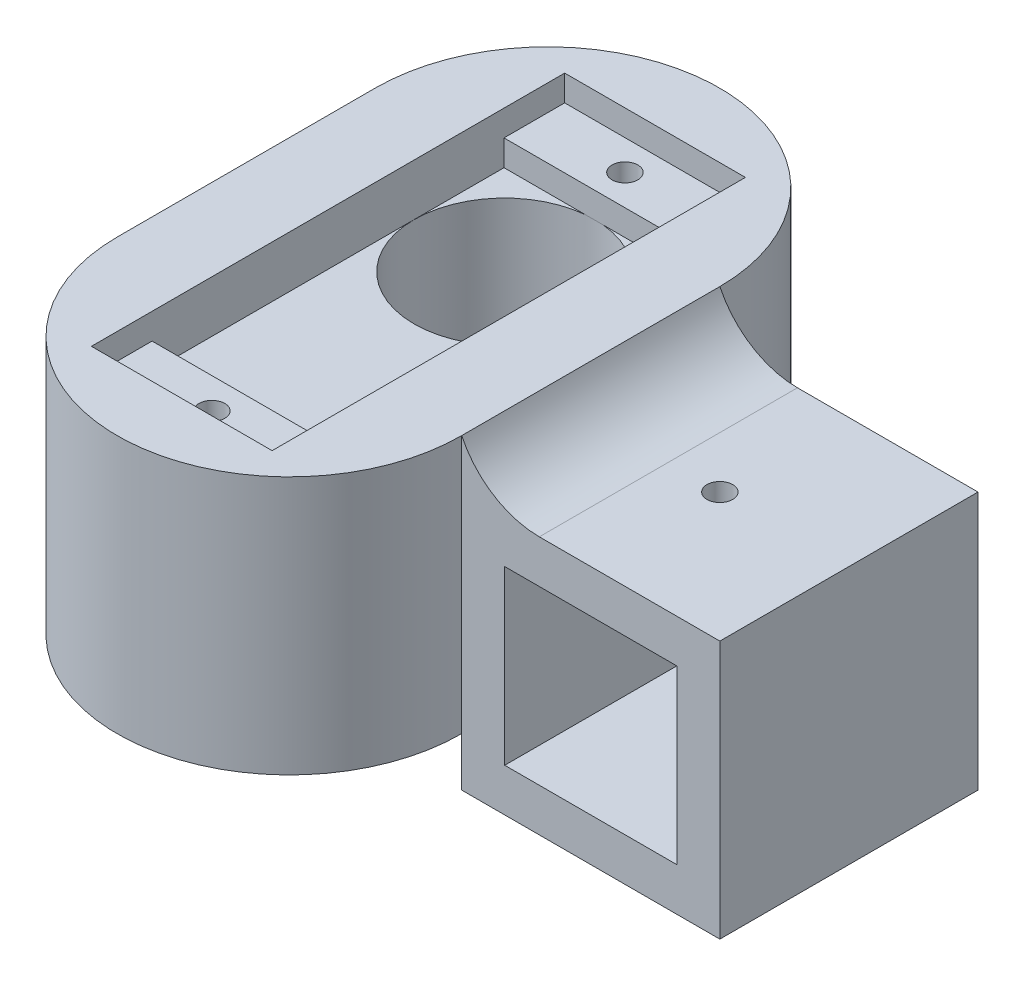
ISO-10303-21;
HEADER;
FILE_DESCRIPTION(('STEP AP214'),'2;1');
FILE_NAME('part.step','',(''),(''),'','','');
FILE_SCHEMA(('AUTOMOTIVE_DESIGN { 1 0 10303 214 1 1 1 1 }'));
ENDSEC;
DATA;
#1=APPLICATION_CONTEXT('core data for automotive mechanical design processes');
#2=APPLICATION_PROTOCOL_DEFINITION('international standard','automotive_design',2000,#1);
#3=PRODUCT_CONTEXT('',#1,'mechanical');
#4=PRODUCT('Part','Part','',(#3));
#5=PRODUCT_RELATED_PRODUCT_CATEGORY('part','',(#4));
#6=PRODUCT_DEFINITION_FORMATION('','',#4);
#7=PRODUCT_DEFINITION_CONTEXT('part definition',#1,'design');
#8=PRODUCT_DEFINITION('design','',#6,#7);
#9=PRODUCT_DEFINITION_SHAPE('','',#8);
#10=(LENGTH_UNIT() NAMED_UNIT(*) SI_UNIT(.MILLI.,.METRE.));
#11=(NAMED_UNIT(*) PLANE_ANGLE_UNIT() SI_UNIT($,.RADIAN.));
#12=(NAMED_UNIT(*) SI_UNIT($,.STERADIAN.) SOLID_ANGLE_UNIT());
#13=UNCERTAINTY_MEASURE_WITH_UNIT(LENGTH_MEASURE(1.E-05),#10,'distance_accuracy_value','');
#14=(GEOMETRIC_REPRESENTATION_CONTEXT(3) GLOBAL_UNCERTAINTY_ASSIGNED_CONTEXT((#13)) GLOBAL_UNIT_ASSIGNED_CONTEXT((#10,
#11,#12)) REPRESENTATION_CONTEXT('',''));
#15=CARTESIAN_POINT('',(0.,0.,0.));
#16=DIRECTION('',(0.,0.,1.));
#17=DIRECTION('',(1.,0.,0.));
#18=AXIS2_PLACEMENT_3D('',#15,#16,#17);
#19=CARTESIAN_POINT('',(-35.,-15.,5.03094143416262));
#20=DIRECTION('',(0.,1.,0.));
#21=DIRECTION('',(0.,0.,1.));
#22=AXIS2_PLACEMENT_3D('',#19,#20,#21);
#23=CYLINDRICAL_SURFACE('',#22,10.5);
#24=CARTESIAN_POINT('',(-35.,14.68,5.03094143416262));
#25=DIRECTION('',(0.,1.,0.));
#26=DIRECTION('',(0.,0.,1.));
#27=AXIS2_PLACEMENT_3D('',#24,#25,#26);
#28=CIRCLE('',#27,10.5);
#29=CARTESIAN_POINT('',(-24.5,14.68,5.03094143416262));
#30=VERTEX_POINT('',#29);
#31=CARTESIAN_POINT('',(-33.976525525477,14.68,-5.41905856583737));
#32=VERTEX_POINT('',#31);
#33=EDGE_CURVE('E204',#30,#32,#28,.T.);
#34=ORIENTED_EDGE('',*,*,#33,.T.);
#35=CARTESIAN_POINT('',(-36.023474474523,14.68,-5.41905856583737));
#36=VERTEX_POINT('',#35);
#37=EDGE_CURVE('E222',#32,#36,#28,.T.);
#38=ORIENTED_EDGE('',*,*,#37,.T.);
#39=CARTESIAN_POINT('',(-45.5,14.68,5.03094143416262));
#40=VERTEX_POINT('',#39);
#41=EDGE_CURVE('E207',#36,#40,#28,.T.);
#42=ORIENTED_EDGE('',*,*,#41,.T.);
#43=EDGE_CURVE('E200',#40,#30,#28,.T.);
#44=ORIENTED_EDGE('',*,*,#43,.T.);
#45=EDGE_LOOP('',(#34,#38,#42,#44));
#46=FACE_BOUND('',#45,.T.);
#47=CARTESIAN_POINT('',(-35.,0.68,5.03094143416262));
#48=DIRECTION('',(0.,-1.,0.));
#49=DIRECTION('',(0.,0.,-1.));
#50=AXIS2_PLACEMENT_3D('',#47,#48,#49);
#51=CIRCLE('',#50,10.5);
#52=CARTESIAN_POINT('',(-35.,0.68,-5.46905856583738));
#53=VERTEX_POINT('',#52);
#54=EDGE_CURVE('E389',#53,#53,#51,.F.);
#55=ORIENTED_EDGE('',*,*,#54,.F.);
#56=EDGE_LOOP('',(#55));
#57=FACE_BOUND('',#56,.T.);
#58=ADVANCED_FACE('F41',(#46,#57),#23,.F.);
#59=CARTESIAN_POINT('',(0.,14.68,0.));
#60=DIRECTION('',(0.,-1.,0.));
#61=DIRECTION('',(0.,0.,-1.));
#62=AXIS2_PLACEMENT_3D('',#59,#60,#61);
#63=PLANE('',#62);
#64=ORIENTED_EDGE('',*,*,#33,.F.);
#65=DIRECTION('',(0.,0.,-1.));
#66=VECTOR('',#65,1.);
#67=CARTESIAN_POINT('',(-24.5,14.68,35.4809414341626));
#68=LINE('',#67,#66);
#69=CARTESIAN_POINT('',(-24.5,14.68,-5.41905856583737));
#70=VERTEX_POINT('',#69);
#71=EDGE_CURVE('E217',#30,#70,#68,.T.);
#72=ORIENTED_EDGE('',*,*,#71,.T.);
#73=DIRECTION('',(-1.,0.,0.));
#74=VECTOR('',#73,1.);
#75=CARTESIAN_POINT('',(-45.5,14.68,-5.41905856583737));
#76=LINE('',#75,#74);
#77=EDGE_CURVE('E220',#70,#32,#76,.T.);
#78=ORIENTED_EDGE('',*,*,#77,.T.);
#79=EDGE_LOOP('',(#64,#72,#78));
#80=FACE_BOUND('',#79,.T.);
#81=ADVANCED_FACE('F216',(#80),#63,.F.);
#82=ORIENTED_EDGE('',*,*,#41,.F.);
#83=CARTESIAN_POINT('',(-45.5,14.68,-5.41905856583737));
#84=VERTEX_POINT('',#83);
#85=EDGE_CURVE('E235',#36,#84,#76,.T.);
#86=ORIENTED_EDGE('',*,*,#85,.T.);
#87=DIRECTION('',(0.,0.,1.));
#88=VECTOR('',#87,1.);
#89=CARTESIAN_POINT('',(-45.5,14.68,35.4809414341626));
#90=LINE('',#89,#88);
#91=EDGE_CURVE('E241',#84,#40,#90,.T.);
#92=ORIENTED_EDGE('',*,*,#91,.T.);
#93=EDGE_LOOP('',(#82,#86,#92));
#94=FACE_BOUND('',#93,.T.);
#95=ADVANCED_FACE('F457',(#94),#63,.F.);
#96=CARTESIAN_POINT('',(0.,17.68,0.));
#97=DIRECTION('',(0.,-1.,0.));
#98=DIRECTION('',(0.,0.,-1.));
#99=AXIS2_PLACEMENT_3D('',#96,#97,#98);
#100=PLANE('',#99);
#101=CARTESIAN_POINT('',(-35.,17.68,39.0309414341626));
#102=DIRECTION('',(0.,1.,0.));
#103=DIRECTION('',(0.,0.,1.));
#104=AXIS2_PLACEMENT_3D('',#101,#102,#103);
#105=CIRCLE('',#104,1.5);
#106=CARTESIAN_POINT('',(-35.,17.68,40.5309414341626));
#107=VERTEX_POINT('',#106);
#108=EDGE_CURVE('E261',#107,#107,#105,.T.);
#109=ORIENTED_EDGE('',*,*,#108,.F.);
#110=EDGE_LOOP('',(#109));
#111=FACE_BOUND('',#110,.T.);
#112=DIRECTION('',(0.,0.,-1.));
#113=VECTOR('',#112,1.);
#114=CARTESIAN_POINT('',(-24.5,17.68,42.5309414341626));
#115=LINE('',#114,#113);
#116=CARTESIAN_POINT('',(-24.5,17.68,42.5309414341626));
#117=VERTEX_POINT('',#116);
#118=CARTESIAN_POINT('',(-24.5,17.68,35.4809414341626));
#119=VERTEX_POINT('',#118);
#120=EDGE_CURVE('E269',#117,#119,#115,.T.);
#121=ORIENTED_EDGE('',*,*,#120,.T.);
#122=DIRECTION('',(1.,0.,0.));
#123=VECTOR('',#122,1.);
#124=CARTESIAN_POINT('',(-45.5,17.68,35.4809414341626));
#125=LINE('',#124,#123);
#126=CARTESIAN_POINT('',(-45.5,17.68,35.4809414341626));
#127=VERTEX_POINT('',#126);
#128=EDGE_CURVE('E230',#127,#119,#125,.T.);
#129=ORIENTED_EDGE('',*,*,#128,.F.);
#130=DIRECTION('',(0.,0.,1.));
#131=VECTOR('',#130,1.);
#132=CARTESIAN_POINT('',(-45.5,17.68,42.5309414341626));
#133=LINE('',#132,#131);
#134=CARTESIAN_POINT('',(-45.5,17.68,42.5309414341626));
#135=VERTEX_POINT('',#134);
#136=EDGE_CURVE('E276',#127,#135,#133,.T.);
#137=ORIENTED_EDGE('',*,*,#136,.T.);
#138=DIRECTION('',(1.,0.,0.));
#139=VECTOR('',#138,1.);
#140=CARTESIAN_POINT('',(-45.5,17.68,42.5309414341626));
#141=LINE('',#140,#139);
#142=EDGE_CURVE('E280',#135,#117,#141,.T.);
#143=ORIENTED_EDGE('',*,*,#142,.T.);
#144=EDGE_LOOP('',(#121,#129,#137,#143));
#145=FACE_BOUND('',#144,.T.);
#146=ADVANCED_FACE('F493',(#111,#145),#100,.F.);
#147=CARTESIAN_POINT('',(0.,10.,30.));
#148=DIRECTION('',(0.,1.,0.));
#149=DIRECTION('',(0.,0.,1.));
#150=AXIS2_PLACEMENT_3D('',#147,#148,#149);
#151=PLANE('',#150);
#152=CARTESIAN_POINT('',(0.,10.,15.));
#153=DIRECTION('',(0.,1.,0.));
#154=DIRECTION('',(0.,0.,1.));
#155=AXIS2_PLACEMENT_3D('',#152,#153,#154);
#156=CIRCLE('',#155,1.5);
#157=CARTESIAN_POINT('',(0.,10.,16.5));
#158=VERTEX_POINT('',#157);
#159=EDGE_CURVE('E832',#158,#158,#156,.T.);
#160=ORIENTED_EDGE('',*,*,#159,.T.);
#161=EDGE_LOOP('',(#160));
#162=FACE_BOUND('',#161,.T.);
#163=DIRECTION('',(1.,0.,0.));
#164=VECTOR('',#163,1.);
#165=CARTESIAN_POINT('',(0.,10.,0.));
#166=LINE('',#165,#164);
#167=CARTESIAN_POINT('',(-10.,10.,0.));
#168=VERTEX_POINT('',#167);
#169=CARTESIAN_POINT('',(10.,10.,0.));
#170=VERTEX_POINT('',#169);
#171=EDGE_CURVE('E368',#168,#170,#166,.T.);
#172=ORIENTED_EDGE('',*,*,#171,.T.);
#173=DIRECTION('',(0.,0.,-1.));
#174=VECTOR('',#173,1.);
#175=CARTESIAN_POINT('',(10.,10.,30.));
#176=LINE('',#175,#174);
#177=CARTESIAN_POINT('',(10.,10.,30.));
#178=VERTEX_POINT('',#177);
#179=EDGE_CURVE('E386',#178,#170,#176,.T.);
#180=ORIENTED_EDGE('',*,*,#179,.F.);
#181=DIRECTION('',(1.,0.,0.));
#182=VECTOR('',#181,1.);
#183=CARTESIAN_POINT('',(0.,10.,30.));
#184=LINE('',#183,#182);
#185=CARTESIAN_POINT('',(-10.,10.,30.));
#186=VERTEX_POINT('',#185);
#187=EDGE_CURVE('E348',#186,#178,#184,.T.);
#188=ORIENTED_EDGE('',*,*,#187,.F.);
#189=DIRECTION('',(0.,0.,-1.));
#190=VECTOR('',#189,1.);
#191=CARTESIAN_POINT('',(-10.,10.,30.));
#192=LINE('',#191,#190);
#193=EDGE_CURVE('E379',#186,#168,#192,.T.);
#194=ORIENTED_EDGE('',*,*,#193,.T.);
#195=EDGE_LOOP('',(#172,#180,#188,#194));
#196=FACE_BOUND('',#195,.T.);
#197=ADVANCED_FACE('F536',(#162,#196),#151,.F.);
#198=CARTESIAN_POINT('',(10.,0.,30.));
#199=DIRECTION('',(1.,0.,0.));
#200=DIRECTION('',(0.,0.,-1.));
#201=AXIS2_PLACEMENT_3D('',#198,#199,#200);
#202=PLANE('',#201);
#203=DIRECTION('',(0.,-1.,0.));
#204=VECTOR('',#203,1.);
#205=CARTESIAN_POINT('',(10.,0.,0.));
#206=LINE('',#205,#204);
#207=CARTESIAN_POINT('',(10.,-10.,0.));
#208=VERTEX_POINT('',#207);
#209=EDGE_CURVE('E371',#170,#208,#206,.T.);
#210=ORIENTED_EDGE('',*,*,#209,.T.);
#211=DIRECTION('',(0.,0.,-1.));
#212=VECTOR('',#211,1.);
#213=CARTESIAN_POINT('',(10.,-10.,30.));
#214=LINE('',#213,#212);
#215=CARTESIAN_POINT('',(10.,-10.,30.));
#216=VERTEX_POINT('',#215);
#217=EDGE_CURVE('E384',#216,#208,#214,.T.);
#218=ORIENTED_EDGE('',*,*,#217,.F.);
#219=DIRECTION('',(0.,-1.,0.));
#220=VECTOR('',#219,1.);
#221=CARTESIAN_POINT('',(10.,0.,30.));
#222=LINE('',#221,#220);
#223=EDGE_CURVE('E351',#178,#216,#222,.T.);
#224=ORIENTED_EDGE('',*,*,#223,.F.);
#225=ORIENTED_EDGE('',*,*,#179,.T.);
#226=EDGE_LOOP('',(#210,#218,#224,#225));
#227=FACE_BOUND('',#226,.T.);
#228=ADVANCED_FACE('F449',(#227),#202,.F.);
#229=CARTESIAN_POINT('',(0.,-10.,30.));
#230=DIRECTION('',(0.,1.,0.));
#231=DIRECTION('',(0.,0.,1.));
#232=AXIS2_PLACEMENT_3D('',#229,#230,#231);
#233=PLANE('',#232);
#234=CARTESIAN_POINT('',(0.,-10.,15.));
#235=DIRECTION('',(0.,1.,0.));
#236=DIRECTION('',(0.,0.,1.));
#237=AXIS2_PLACEMENT_3D('',#234,#235,#236);
#238=CIRCLE('',#237,1.5);
#239=CARTESIAN_POINT('',(0.,-10.,16.5));
#240=VERTEX_POINT('',#239);
#241=EDGE_CURVE('E834',#240,#240,#238,.T.);
#242=ORIENTED_EDGE('',*,*,#241,.F.);
#243=EDGE_LOOP('',(#242));
#244=FACE_BOUND('',#243,.T.);
#245=DIRECTION('',(1.,0.,0.));
#246=VECTOR('',#245,1.);
#247=CARTESIAN_POINT('',(0.,-10.,0.));
#248=LINE('',#247,#246);
#249=CARTESIAN_POINT('',(-10.,-10.,0.));
#250=VERTEX_POINT('',#249);
#251=EDGE_CURVE('E374',#250,#208,#248,.T.);
#252=ORIENTED_EDGE('',*,*,#251,.F.);
#253=DIRECTION('',(0.,0.,-1.));
#254=VECTOR('',#253,1.);
#255=CARTESIAN_POINT('',(-10.,-10.,30.));
#256=LINE('',#255,#254);
#257=CARTESIAN_POINT('',(-10.,-10.,30.));
#258=VERTEX_POINT('',#257);
#259=EDGE_CURVE('E381',#258,#250,#256,.T.);
#260=ORIENTED_EDGE('',*,*,#259,.F.);
#261=DIRECTION('',(1.,0.,0.));
#262=VECTOR('',#261,1.);
#263=CARTESIAN_POINT('',(0.,-10.,30.));
#264=LINE('',#263,#262);
#265=EDGE_CURVE('E353',#258,#216,#264,.T.);
#266=ORIENTED_EDGE('',*,*,#265,.T.);
#267=ORIENTED_EDGE('',*,*,#217,.T.);
#268=EDGE_LOOP('',(#252,#260,#266,#267));
#269=FACE_BOUND('',#268,.T.);
#270=ADVANCED_FACE('F442',(#244,#269),#233,.T.);
#271=CARTESIAN_POINT('',(15.,0.,30.));
#272=DIRECTION('',(1.,0.,0.));
#273=DIRECTION('',(0.,1.,0.));
#274=AXIS2_PLACEMENT_3D('',#271,#272,#273);
#275=PLANE('',#274);
#276=DIRECTION('',(0.,-1.,0.));
#277=VECTOR('',#276,1.);
#278=CARTESIAN_POINT('',(15.,0.,0.));
#279=LINE('',#278,#277);
#280=CARTESIAN_POINT('',(15.,15.,0.));
#281=VERTEX_POINT('',#280);
#282=CARTESIAN_POINT('',(15.,-15.,0.));
#283=VERTEX_POINT('',#282);
#284=EDGE_CURVE('E330',#281,#283,#279,.T.);
#285=ORIENTED_EDGE('',*,*,#284,.F.);
#286=DIRECTION('',(0.,0.,-1.));
#287=VECTOR('',#286,1.);
#288=CARTESIAN_POINT('',(15.,15.,30.));
#289=LINE('',#288,#287);
#290=CARTESIAN_POINT('',(15.,15.,30.));
#291=VERTEX_POINT('',#290);
#292=EDGE_CURVE('E382',#291,#281,#289,.T.);
#293=ORIENTED_EDGE('',*,*,#292,.F.);
#294=DIRECTION('',(0.,-1.,0.));
#295=VECTOR('',#294,1.);
#296=CARTESIAN_POINT('',(15.,0.,30.));
#297=LINE('',#296,#295);
#298=CARTESIAN_POINT('',(15.,-15.,30.));
#299=VERTEX_POINT('',#298);
#300=EDGE_CURVE('E336',#291,#299,#297,.T.);
#301=ORIENTED_EDGE('',*,*,#300,.T.);
#302=DIRECTION('',(0.,0.,-1.));
#303=VECTOR('',#302,1.);
#304=CARTESIAN_POINT('',(15.,-15.,30.));
#305=LINE('',#304,#303);
#306=EDGE_CURVE('E359',#299,#283,#305,.T.);
#307=ORIENTED_EDGE('',*,*,#306,.T.);
#308=EDGE_LOOP('',(#285,#293,#301,#307));
#309=FACE_BOUND('',#308,.T.);
#310=ADVANCED_FACE('F440',(#309),#275,.T.);
#311=CARTESIAN_POINT('',(0.,15.,30.));
#312=DIRECTION('',(0.,1.,0.));
#313=DIRECTION('',(0.,0.,1.));
#314=AXIS2_PLACEMENT_3D('',#311,#312,#313);
#315=PLANE('',#314);
#316=CARTESIAN_POINT('',(0.,15.,15.));
#317=DIRECTION('',(0.,1.,0.));
#318=DIRECTION('',(0.,0.,1.));
#319=AXIS2_PLACEMENT_3D('',#316,#317,#318);
#320=CIRCLE('',#319,1.5);
#321=CARTESIAN_POINT('',(0.,15.,16.5));
#322=VERTEX_POINT('',#321);
#323=EDGE_CURVE('E829',#322,#322,#320,.T.);
#324=ORIENTED_EDGE('',*,*,#323,.F.);
#325=EDGE_LOOP('',(#324));
#326=FACE_BOUND('',#325,.T.);
#327=DIRECTION('',(1.,0.,0.));
#328=VECTOR('',#327,1.);
#329=CARTESIAN_POINT('',(0.,15.,0.));
#330=LINE('',#329,#328);
#331=CARTESIAN_POINT('',(-5.98126394664973,15.,0.));
#332=VERTEX_POINT('',#331);
#333=EDGE_CURVE('E362',#332,#281,#330,.T.);
#334=ORIENTED_EDGE('',*,*,#333,.F.);
#335=DIRECTION('',(0.,0.,1.));
#336=VECTOR('',#335,1.);
#337=CARTESIAN_POINT('',(-5.98126394664973,15.,30.));
#338=LINE('',#337,#336);
#339=CARTESIAN_POINT('',(-5.98126394664973,15.,30.));
#340=VERTEX_POINT('',#339);
#341=EDGE_CURVE('E64',#332,#340,#338,.T.);
#342=ORIENTED_EDGE('',*,*,#341,.T.);
#343=DIRECTION('',(1.,0.,0.));
#344=VECTOR('',#343,1.);
#345=CARTESIAN_POINT('',(0.,15.,30.));
#346=LINE('',#345,#344);
#347=EDGE_CURVE('E339',#340,#291,#346,.T.);
#348=ORIENTED_EDGE('',*,*,#347,.T.);
#349=ORIENTED_EDGE('',*,*,#292,.T.);
#350=EDGE_LOOP('',(#334,#342,#348,#349));
#351=FACE_BOUND('',#350,.T.);
#352=ADVANCED_FACE('F405',(#326,#351),#315,.T.);
#353=CARTESIAN_POINT('',(-15.,0.,30.));
#354=DIRECTION('',(1.,0.,0.));
#355=DIRECTION('',(0.,0.,-1.));
#356=AXIS2_PLACEMENT_3D('',#353,#354,#355);
#357=PLANE('',#356);
#358=DIRECTION('',(0.,0.,-1.));
#359=VECTOR('',#358,1.);
#360=CARTESIAN_POINT('',(-15.,-9.32,30.0309414341626));
#361=LINE('',#360,#359);
#362=CARTESIAN_POINT('',(-15.,-9.32,30.));
#363=VERTEX_POINT('',#362);
#364=CARTESIAN_POINT('',(-15.,-9.32,0.0309414341626291));
#365=VERTEX_POINT('',#364);
#366=EDGE_CURVE('E306',#363,#365,#361,.T.);
#367=ORIENTED_EDGE('',*,*,#366,.T.);
#368=DIRECTION('',(0.,1.,0.));
#369=VECTOR('',#368,1.);
#370=CARTESIAN_POINT('',(-15.,-9.32,0.0309414341626291));
#371=LINE('',#370,#369);
#372=CARTESIAN_POINT('',(-15.,20.68,0.0309414341626291));
#373=VERTEX_POINT('',#372);
#374=EDGE_CURVE('E333',#365,#373,#371,.T.);
#375=ORIENTED_EDGE('',*,*,#374,.T.);
#376=DIRECTION('',(0.,0.,-1.));
#377=VECTOR('',#376,1.);
#378=CARTESIAN_POINT('',(-15.,20.68,0.0309414341626291));
#379=LINE('',#378,#377);
#380=CARTESIAN_POINT('',(-15.,20.68,0.));
#381=VERTEX_POINT('',#380);
#382=EDGE_CURVE('E399',#373,#381,#379,.T.);
#383=ORIENTED_EDGE('',*,*,#382,.T.);
#384=DIRECTION('',(0.,-1.,0.));
#385=VECTOR('',#384,1.);
#386=CARTESIAN_POINT('',(-15.,0.,0.));
#387=LINE('',#386,#385);
#388=CARTESIAN_POINT('',(-15.,-15.,0.));
#389=VERTEX_POINT('',#388);
#390=EDGE_CURVE('E56',#381,#389,#387,.T.);
#391=ORIENTED_EDGE('',*,*,#390,.T.);
#392=DIRECTION('',(0.,0.,-1.));
#393=VECTOR('',#392,1.);
#394=CARTESIAN_POINT('',(-15.,-15.,30.));
#395=LINE('',#394,#393);
#396=CARTESIAN_POINT('',(-15.,-15.,30.));
#397=VERTEX_POINT('',#396);
#398=EDGE_CURVE('E391',#397,#389,#395,.T.);
#399=ORIENTED_EDGE('',*,*,#398,.F.);
#400=DIRECTION('',(0.,-1.,0.));
#401=VECTOR('',#400,1.);
#402=CARTESIAN_POINT('',(-15.,0.,30.));
#403=LINE('',#402,#401);
#404=EDGE_CURVE('E342',#363,#397,#403,.T.);
#405=ORIENTED_EDGE('',*,*,#404,.F.);
#406=EDGE_LOOP('',(#367,#375,#383,#391,#399,#405));
#407=FACE_BOUND('',#406,.T.);
#408=ADVANCED_FACE('F434',(#407),#357,.F.);
#409=CARTESIAN_POINT('',(0.,-15.,30.));
#410=DIRECTION('',(0.,1.,0.));
#411=DIRECTION('',(0.,0.,1.));
#412=AXIS2_PLACEMENT_3D('',#409,#410,#411);
#413=PLANE('',#412);
#414=CARTESIAN_POINT('',(0.,-15.,15.));
#415=DIRECTION('',(0.,1.,0.));
#416=DIRECTION('',(0.,0.,1.));
#417=AXIS2_PLACEMENT_3D('',#414,#415,#416);
#418=CIRCLE('',#417,1.5);
#419=CARTESIAN_POINT('',(0.,-15.,16.5));
#420=VERTEX_POINT('',#419);
#421=EDGE_CURVE('E838',#420,#420,#418,.T.);
#422=ORIENTED_EDGE('',*,*,#421,.T.);
#423=EDGE_LOOP('',(#422));
#424=FACE_BOUND('',#423,.T.);
#425=DIRECTION('',(1.,0.,0.));
#426=VECTOR('',#425,1.);
#427=CARTESIAN_POINT('',(0.,-15.,0.));
#428=LINE('',#427,#426);
#429=EDGE_CURVE('E365',#389,#283,#428,.T.);
#430=ORIENTED_EDGE('',*,*,#429,.T.);
#431=ORIENTED_EDGE('',*,*,#306,.F.);
#432=DIRECTION('',(1.,0.,0.));
#433=VECTOR('',#432,1.);
#434=CARTESIAN_POINT('',(0.,-15.,30.));
#435=LINE('',#434,#433);
#436=EDGE_CURVE('E346',#397,#299,#435,.T.);
#437=ORIENTED_EDGE('',*,*,#436,.F.);
#438=ORIENTED_EDGE('',*,*,#398,.T.);
#439=EDGE_LOOP('',(#430,#431,#437,#438));
#440=FACE_BOUND('',#439,.T.);
#441=ADVANCED_FACE('F438',(#424,#440),#413,.F.);
#442=CARTESIAN_POINT('',(-10.,0.,30.));
#443=DIRECTION('',(1.,0.,0.));
#444=DIRECTION('',(0.,1.,0.));
#445=AXIS2_PLACEMENT_3D('',#442,#443,#444);
#446=PLANE('',#445);
#447=DIRECTION('',(0.,-1.,0.));
#448=VECTOR('',#447,1.);
#449=CARTESIAN_POINT('',(-10.,0.,0.));
#450=LINE('',#449,#448);
#451=EDGE_CURVE('E340',#168,#250,#450,.T.);
#452=ORIENTED_EDGE('',*,*,#451,.F.);
#453=ORIENTED_EDGE('',*,*,#193,.F.);
#454=DIRECTION('',(0.,-1.,0.));
#455=VECTOR('',#454,1.);
#456=CARTESIAN_POINT('',(-10.,0.,30.));
#457=LINE('',#456,#455);
#458=EDGE_CURVE('E356',#186,#258,#457,.T.);
#459=ORIENTED_EDGE('',*,*,#458,.T.);
#460=ORIENTED_EDGE('',*,*,#259,.T.);
#461=EDGE_LOOP('',(#452,#453,#459,#460));
#462=FACE_BOUND('',#461,.T.);
#463=ADVANCED_FACE('F528',(#462),#446,.T.);
#464=CARTESIAN_POINT('',(0.,0.,30.));
#465=DIRECTION('',(0.,0.,1.));
#466=DIRECTION('',(1.,0.,0.));
#467=AXIS2_PLACEMENT_3D('',#464,#465,#466);
#468=PLANE('',#467);
#469=ORIENTED_EDGE('',*,*,#300,.F.);
#470=ORIENTED_EDGE('',*,*,#347,.F.);
#471=CARTESIAN_POINT('',(-5.98126394664973,25.,30.));
#472=DIRECTION('',(0.,0.,1.));
#473=DIRECTION('',(1.,0.,0.));
#474=AXIS2_PLACEMENT_3D('',#471,#472,#473);
#475=CIRCLE('',#474,10.);
#476=CARTESIAN_POINT('',(-15.,20.68,30.));
#477=VERTEX_POINT('',#476);
#478=EDGE_CURVE('E11',#340,#477,#475,.F.);
#479=ORIENTED_EDGE('',*,*,#478,.T.);
#480=EDGE_CURVE('E343',#477,#363,#403,.T.);
#481=ORIENTED_EDGE('',*,*,#480,.T.);
#482=ORIENTED_EDGE('',*,*,#404,.T.);
#483=ORIENTED_EDGE('',*,*,#436,.T.);
#484=EDGE_LOOP('',(#469,#470,#479,#481,#482,#483));
#485=FACE_BOUND('',#484,.T.);
#486=ORIENTED_EDGE('',*,*,#187,.T.);
#487=ORIENTED_EDGE('',*,*,#223,.T.);
#488=ORIENTED_EDGE('',*,*,#265,.F.);
#489=ORIENTED_EDGE('',*,*,#458,.F.);
#490=EDGE_LOOP('',(#486,#487,#488,#489));
#491=FACE_BOUND('',#490,.T.);
#492=ADVANCED_FACE('F413',(#485,#491),#468,.T.);
#493=CARTESIAN_POINT('',(0.,0.,0.));
#494=DIRECTION('',(0.,0.,1.));
#495=DIRECTION('',(1.,0.,0.));
#496=AXIS2_PLACEMENT_3D('',#493,#494,#495);
#497=PLANE('',#496);
#498=ORIENTED_EDGE('',*,*,#284,.T.);
#499=ORIENTED_EDGE('',*,*,#429,.F.);
#500=ORIENTED_EDGE('',*,*,#390,.F.);
#501=CARTESIAN_POINT('',(-5.98126394664973,25.,0.));
#502=DIRECTION('',(0.,0.,1.));
#503=DIRECTION('',(1.,0.,0.));
#504=AXIS2_PLACEMENT_3D('',#501,#502,#503);
#505=CIRCLE('',#504,10.);
#506=EDGE_CURVE('E49',#381,#332,#505,.T.);
#507=ORIENTED_EDGE('',*,*,#506,.T.);
#508=ORIENTED_EDGE('',*,*,#333,.T.);
#509=EDGE_LOOP('',(#498,#499,#500,#507,#508));
#510=FACE_BOUND('',#509,.T.);
#511=ORIENTED_EDGE('',*,*,#171,.F.);
#512=ORIENTED_EDGE('',*,*,#451,.T.);
#513=ORIENTED_EDGE('',*,*,#251,.T.);
#514=ORIENTED_EDGE('',*,*,#209,.F.);
#515=EDGE_LOOP('',(#511,#512,#513,#514));
#516=FACE_BOUND('',#515,.T.);
#517=ADVANCED_FACE('F401',(#510,#516),#497,.F.);
#518=CARTESIAN_POINT('',(-35.,-9.32,30.0309414341626));
#519=DIRECTION('',(0.,1.,0.));
#520=DIRECTION('',(0.,0.,1.));
#521=AXIS2_PLACEMENT_3D('',#518,#519,#520);
#522=CYLINDRICAL_SURFACE('',#521,20.);
#523=CARTESIAN_POINT('',(-35.,20.68,30.0309414341626));
#524=DIRECTION('',(0.,1.,0.));
#525=DIRECTION('',(0.,0.,-1.));
#526=AXIS2_PLACEMENT_3D('',#523,#524,#525);
#527=CIRCLE('',#526,20.);
#528=CARTESIAN_POINT('',(-55.,20.68,30.0309414341626));
#529=VERTEX_POINT('',#528);
#530=CARTESIAN_POINT('',(-15.,20.68,30.0309414341626));
#531=VERTEX_POINT('',#530);
#532=EDGE_CURVE('E296',#529,#531,#527,.T.);
#533=ORIENTED_EDGE('',*,*,#532,.F.);
#534=DIRECTION('',(0.,1.,0.));
#535=VECTOR('',#534,1.);
#536=CARTESIAN_POINT('',(-55.,-9.32,30.0309414341626));
#537=LINE('',#536,#535);
#538=CARTESIAN_POINT('',(-55.,-9.32,30.0309414341626));
#539=VERTEX_POINT('',#538);
#540=EDGE_CURVE('E328',#539,#529,#537,.T.);
#541=ORIENTED_EDGE('',*,*,#540,.F.);
#542=CARTESIAN_POINT('',(-35.,-9.32,30.0309414341626));
#543=DIRECTION('',(0.,1.,0.));
#544=DIRECTION('',(0.,0.,-1.));
#545=AXIS2_PLACEMENT_3D('',#542,#543,#544);
#546=CIRCLE('',#545,20.);
#547=CARTESIAN_POINT('',(-15.,-9.32,30.0309414341626));
#548=VERTEX_POINT('',#547);
#549=EDGE_CURVE('E303',#539,#548,#546,.T.);
#550=ORIENTED_EDGE('',*,*,#549,.T.);
#551=DIRECTION('',(0.,1.,0.));
#552=VECTOR('',#551,1.);
#553=CARTESIAN_POINT('',(-15.,-9.32,30.0309414341626));
#554=LINE('',#553,#552);
#555=EDGE_CURVE('E316',#548,#531,#554,.T.);
#556=ORIENTED_EDGE('',*,*,#555,.T.);
#557=EDGE_LOOP('',(#533,#541,#550,#556));
#558=FACE_BOUND('',#557,.T.);
#559=ADVANCED_FACE('F516',(#558),#522,.T.);
#560=CARTESIAN_POINT('',(-55.,-9.32,30.0309414341626));
#561=DIRECTION('',(-1.,0.,0.));
#562=DIRECTION('',(0.,0.,1.));
#563=AXIS2_PLACEMENT_3D('',#560,#561,#562);
#564=PLANE('',#563);
#565=DIRECTION('',(0.,0.,1.));
#566=VECTOR('',#565,1.);
#567=CARTESIAN_POINT('',(-55.,20.68,30.0309414341626));
#568=LINE('',#567,#566);
#569=CARTESIAN_POINT('',(-55.,20.68,0.0309414341626327));
#570=VERTEX_POINT('',#569);
#571=EDGE_CURVE('E307',#570,#529,#568,.T.);
#572=ORIENTED_EDGE('',*,*,#571,.F.);
#573=DIRECTION('',(0.,1.,0.));
#574=VECTOR('',#573,1.);
#575=CARTESIAN_POINT('',(-55.,-9.32,0.0309414341626327));
#576=LINE('',#575,#574);
#577=CARTESIAN_POINT('',(-55.,-9.32,0.0309414341626327));
#578=VERTEX_POINT('',#577);
#579=EDGE_CURVE('E331',#578,#570,#576,.T.);
#580=ORIENTED_EDGE('',*,*,#579,.F.);
#581=DIRECTION('',(0.,0.,1.));
#582=VECTOR('',#581,1.);
#583=CARTESIAN_POINT('',(-55.,-9.32,30.0309414341626));
#584=LINE('',#583,#582);
#585=EDGE_CURVE('E313',#578,#539,#584,.T.);
#586=ORIENTED_EDGE('',*,*,#585,.T.);
#587=ORIENTED_EDGE('',*,*,#540,.T.);
#588=EDGE_LOOP('',(#572,#580,#586,#587));
#589=FACE_BOUND('',#588,.T.);
#590=ADVANCED_FACE('F512',(#589),#564,.T.);
#591=CARTESIAN_POINT('',(-35.,-9.32,0.0309414341626291));
#592=DIRECTION('',(0.,1.,0.));
#593=DIRECTION('',(0.,0.,1.));
#594=AXIS2_PLACEMENT_3D('',#591,#592,#593);
#595=CYLINDRICAL_SURFACE('',#594,20.);
#596=CARTESIAN_POINT('',(-35.,20.68,0.0309414341626291));
#597=DIRECTION('',(0.,1.,0.));
#598=DIRECTION('',(0.,0.,-1.));
#599=AXIS2_PLACEMENT_3D('',#596,#597,#598);
#600=CIRCLE('',#599,20.);
#601=EDGE_CURVE('E323',#373,#570,#600,.T.);
#602=ORIENTED_EDGE('',*,*,#601,.F.);
#603=ORIENTED_EDGE('',*,*,#374,.F.);
#604=CARTESIAN_POINT('',(-35.,-9.32,0.0309414341626291));
#605=DIRECTION('',(0.,1.,0.));
#606=DIRECTION('',(0.,0.,-1.));
#607=AXIS2_PLACEMENT_3D('',#604,#605,#606);
#608=CIRCLE('',#607,20.);
#609=EDGE_CURVE('E310',#365,#578,#608,.T.);
#610=ORIENTED_EDGE('',*,*,#609,.T.);
#611=ORIENTED_EDGE('',*,*,#579,.T.);
#612=EDGE_LOOP('',(#602,#603,#610,#611));
#613=FACE_BOUND('',#612,.T.);
#614=ADVANCED_FACE('F515',(#613),#595,.T.);
#615=CARTESIAN_POINT('',(-15.,-9.32,30.0309414341626));
#616=DIRECTION('',(1.,0.,0.));
#617=DIRECTION('',(0.,0.,-1.));
#618=AXIS2_PLACEMENT_3D('',#615,#616,#617);
#619=PLANE('',#618);
#620=ORIENTED_EDGE('',*,*,#480,.F.);
#621=DIRECTION('',(0.,0.,-1.));
#622=VECTOR('',#621,1.);
#623=CARTESIAN_POINT('',(-15.,20.68,30.0309414341626));
#624=LINE('',#623,#622);
#625=EDGE_CURVE('E320',#531,#477,#624,.T.);
#626=ORIENTED_EDGE('',*,*,#625,.F.);
#627=ORIENTED_EDGE('',*,*,#555,.F.);
#628=EDGE_CURVE('E308',#548,#363,#361,.T.);
#629=ORIENTED_EDGE('',*,*,#628,.T.);
#630=EDGE_LOOP('',(#620,#626,#627,#629));
#631=FACE_BOUND('',#630,.T.);
#632=ADVANCED_FACE('F421',(#631),#619,.T.);
#633=CARTESIAN_POINT('',(-35.,-9.32,30.0309414341626));
#634=DIRECTION('',(0.,-1.,0.));
#635=DIRECTION('',(0.,0.,-1.));
#636=AXIS2_PLACEMENT_3D('',#633,#634,#635);
#637=PLANE('',#636);
#638=ORIENTED_EDGE('',*,*,#549,.F.);
#639=ORIENTED_EDGE('',*,*,#585,.F.);
#640=ORIENTED_EDGE('',*,*,#609,.F.);
#641=ORIENTED_EDGE('',*,*,#366,.F.);
#642=ORIENTED_EDGE('',*,*,#628,.F.);
#643=EDGE_LOOP('',(#638,#639,#640,#641,#642));
#644=FACE_BOUND('',#643,.T.);
#645=CARTESIAN_POINT('',(-35.,-9.32,5.03094143416262));
#646=DIRECTION('',(0.,-1.,0.));
#647=DIRECTION('',(0.,0.,-1.));
#648=AXIS2_PLACEMENT_3D('',#645,#646,#647);
#649=CIRCLE('',#648,4.);
#650=CARTESIAN_POINT('',(-35.,-9.32,1.03094143416263));
#651=VERTEX_POINT('',#650);
#652=EDGE_CURVE('E833',#651,#651,#649,.T.);
#653=ORIENTED_EDGE('',*,*,#652,.F.);
#654=EDGE_LOOP('',(#653));
#655=FACE_BOUND('',#654,.T.);
#656=ADVANCED_FACE('F429',(#644,#655),#637,.T.);
#657=CARTESIAN_POINT('',(-35.,20.68,30.0309414341626));
#658=DIRECTION('',(0.,-1.,0.));
#659=DIRECTION('',(0.,0.,-1.));
#660=AXIS2_PLACEMENT_3D('',#657,#658,#659);
#661=PLANE('',#660);
#662=DIRECTION('',(-1.,0.,0.));
#663=VECTOR('',#662,1.);
#664=CARTESIAN_POINT('',(-45.5,20.68,-12.4690585658374));
#665=LINE('',#664,#663);
#666=CARTESIAN_POINT('',(-24.5,20.68,-12.4690585658374));
#667=VERTEX_POINT('',#666);
#668=CARTESIAN_POINT('',(-45.5,20.68,-12.4690585658374));
#669=VERTEX_POINT('',#668);
#670=EDGE_CURVE('E285',#667,#669,#665,.T.);
#671=ORIENTED_EDGE('',*,*,#670,.F.);
#672=DIRECTION('',(0.,0.,-1.));
#673=VECTOR('',#672,1.);
#674=CARTESIAN_POINT('',(-24.5,20.68,42.5309414341626));
#675=LINE('',#674,#673);
#676=CARTESIAN_POINT('',(-24.5,20.68,42.5309414341626));
#677=VERTEX_POINT('',#676);
#678=EDGE_CURVE('E260',#677,#667,#675,.T.);
#679=ORIENTED_EDGE('',*,*,#678,.F.);
#680=DIRECTION('',(1.,0.,0.));
#681=VECTOR('',#680,1.);
#682=CARTESIAN_POINT('',(-45.5,20.68,42.5309414341626));
#683=LINE('',#682,#681);
#684=CARTESIAN_POINT('',(-45.5,20.68,42.5309414341626));
#685=VERTEX_POINT('',#684);
#686=EDGE_CURVE('E291',#685,#677,#683,.T.);
#687=ORIENTED_EDGE('',*,*,#686,.F.);
#688=DIRECTION('',(0.,0.,1.));
#689=VECTOR('',#688,1.);
#690=CARTESIAN_POINT('',(-45.5,20.68,42.5309414341626));
#691=LINE('',#690,#689);
#692=EDGE_CURVE('E288',#669,#685,#691,.T.);
#693=ORIENTED_EDGE('',*,*,#692,.F.);
#694=EDGE_LOOP('',(#671,#679,#687,#693));
#695=FACE_BOUND('',#694,.T.);
#696=ORIENTED_EDGE('',*,*,#532,.T.);
#697=ORIENTED_EDGE('',*,*,#625,.T.);
#698=EDGE_CURVE('E319',#477,#373,#624,.T.);
#699=ORIENTED_EDGE('',*,*,#698,.T.);
#700=ORIENTED_EDGE('',*,*,#601,.T.);
#701=ORIENTED_EDGE('',*,*,#571,.T.);
#702=EDGE_LOOP('',(#696,#697,#699,#700,#701));
#703=FACE_BOUND('',#702,.T.);
#704=ADVANCED_FACE('F417',(#695,#703),#661,.F.);
#705=CARTESIAN_POINT('',(-24.5,17.68,42.5309414341626));
#706=DIRECTION('',(1.,0.,0.));
#707=DIRECTION('',(0.,0.,-1.));
#708=AXIS2_PLACEMENT_3D('',#705,#706,#707);
#709=PLANE('',#708);
#710=ORIENTED_EDGE('',*,*,#678,.T.);
#711=DIRECTION('',(0.,1.,0.));
#712=VECTOR('',#711,1.);
#713=CARTESIAN_POINT('',(-24.5,17.68,-12.4690585658374));
#714=LINE('',#713,#712);
#715=CARTESIAN_POINT('',(-24.5,17.68,-12.4690585658374));
#716=VERTEX_POINT('',#715);
#717=EDGE_CURVE('E283',#716,#667,#714,.T.);
#718=ORIENTED_EDGE('',*,*,#717,.F.);
#719=CARTESIAN_POINT('',(-24.5,17.68,-5.41905856583737));
#720=VERTEX_POINT('',#719);
#721=EDGE_CURVE('E273',#720,#716,#115,.T.);
#722=ORIENTED_EDGE('',*,*,#721,.F.);
#723=DIRECTION('',(0.,1.,0.));
#724=VECTOR('',#723,1.);
#725=CARTESIAN_POINT('',(-24.5,14.68,-5.41905856583737));
#726=LINE('',#725,#724);
#727=EDGE_CURVE('E229',#70,#720,#726,.T.);
#728=ORIENTED_EDGE('',*,*,#727,.F.);
#729=ORIENTED_EDGE('',*,*,#71,.F.);
#730=CARTESIAN_POINT('',(-24.5,14.68,35.4809414341626));
#731=VERTEX_POINT('',#730);
#732=EDGE_CURVE('E226',#731,#30,#68,.T.);
#733=ORIENTED_EDGE('',*,*,#732,.F.);
#734=DIRECTION('',(0.,1.,0.));
#735=VECTOR('',#734,1.);
#736=CARTESIAN_POINT('',(-24.5,14.68,35.4809414341626));
#737=LINE('',#736,#735);
#738=EDGE_CURVE('E249',#731,#119,#737,.T.);
#739=ORIENTED_EDGE('',*,*,#738,.T.);
#740=ORIENTED_EDGE('',*,*,#120,.F.);
#741=DIRECTION('',(0.,1.,0.));
#742=VECTOR('',#741,1.);
#743=CARTESIAN_POINT('',(-24.5,17.68,42.5309414341626));
#744=LINE('',#743,#742);
#745=EDGE_CURVE('E294',#117,#677,#744,.T.);
#746=ORIENTED_EDGE('',*,*,#745,.T.);
#747=EDGE_LOOP('',(#710,#718,#722,#728,#729,#733,#739,#740,#746));
#748=FACE_BOUND('',#747,.T.);
#749=ADVANCED_FACE('F225',(#748),#709,.F.);
#750=CARTESIAN_POINT('',(-45.5,17.68,42.5309414341626));
#751=DIRECTION('',(0.,0.,1.));
#752=DIRECTION('',(1.,0.,0.));
#753=AXIS2_PLACEMENT_3D('',#750,#751,#752);
#754=PLANE('',#753);
#755=ORIENTED_EDGE('',*,*,#686,.T.);
#756=ORIENTED_EDGE('',*,*,#745,.F.);
#757=ORIENTED_EDGE('',*,*,#142,.F.);
#758=DIRECTION('',(0.,1.,0.));
#759=VECTOR('',#758,1.);
#760=CARTESIAN_POINT('',(-45.5,17.68,42.5309414341626));
#761=LINE('',#760,#759);
#762=EDGE_CURVE('E297',#135,#685,#761,.T.);
#763=ORIENTED_EDGE('',*,*,#762,.T.);
#764=EDGE_LOOP('',(#755,#756,#757,#763));
#765=FACE_BOUND('',#764,.T.);
#766=ADVANCED_FACE('F494',(#765),#754,.F.);
#767=CARTESIAN_POINT('',(-45.5,17.68,42.5309414341626));
#768=DIRECTION('',(-1.,0.,0.));
#769=DIRECTION('',(0.,0.,1.));
#770=AXIS2_PLACEMENT_3D('',#767,#768,#769);
#771=PLANE('',#770);
#772=ORIENTED_EDGE('',*,*,#692,.T.);
#773=ORIENTED_EDGE('',*,*,#762,.F.);
#774=ORIENTED_EDGE('',*,*,#136,.F.);
#775=DIRECTION('',(0.,1.,0.));
#776=VECTOR('',#775,1.);
#777=CARTESIAN_POINT('',(-45.5,14.68,35.4809414341626));
#778=LINE('',#777,#776);
#779=CARTESIAN_POINT('',(-45.5,14.68,35.4809414341626));
#780=VERTEX_POINT('',#779);
#781=EDGE_CURVE('E252',#780,#127,#778,.T.);
#782=ORIENTED_EDGE('',*,*,#781,.F.);
#783=EDGE_CURVE('E240',#40,#780,#90,.T.);
#784=ORIENTED_EDGE('',*,*,#783,.F.);
#785=ORIENTED_EDGE('',*,*,#91,.F.);
#786=DIRECTION('',(0.,1.,0.));
#787=VECTOR('',#786,1.);
#788=CARTESIAN_POINT('',(-45.5,14.68,-5.41905856583737));
#789=LINE('',#788,#787);
#790=CARTESIAN_POINT('',(-45.5,17.68,-5.41905856583737));
#791=VERTEX_POINT('',#790);
#792=EDGE_CURVE('E254',#84,#791,#789,.T.);
#793=ORIENTED_EDGE('',*,*,#792,.T.);
#794=CARTESIAN_POINT('',(-45.5,17.68,-12.4690585658374));
#795=VERTEX_POINT('',#794);
#796=EDGE_CURVE('E277',#795,#791,#133,.T.);
#797=ORIENTED_EDGE('',*,*,#796,.F.);
#798=DIRECTION('',(0.,1.,0.));
#799=VECTOR('',#798,1.);
#800=CARTESIAN_POINT('',(-45.5,17.68,-12.4690585658374));
#801=LINE('',#800,#799);
#802=EDGE_CURVE('E299',#795,#669,#801,.T.);
#803=ORIENTED_EDGE('',*,*,#802,.T.);
#804=EDGE_LOOP('',(#772,#773,#774,#782,#784,#785,#793,#797,#803));
#805=FACE_BOUND('',#804,.T.);
#806=ADVANCED_FACE('F497',(#805),#771,.F.);
#807=CARTESIAN_POINT('',(-45.5,17.68,-12.4690585658374));
#808=DIRECTION('',(0.,0.,-1.));
#809=DIRECTION('',(-1.,0.,0.));
#810=AXIS2_PLACEMENT_3D('',#807,#808,#809);
#811=PLANE('',#810);
#812=ORIENTED_EDGE('',*,*,#670,.T.);
#813=ORIENTED_EDGE('',*,*,#802,.F.);
#814=DIRECTION('',(-1.,0.,0.));
#815=VECTOR('',#814,1.);
#816=CARTESIAN_POINT('',(-45.5,17.68,-12.4690585658374));
#817=LINE('',#816,#815);
#818=EDGE_CURVE('E272',#716,#795,#817,.T.);
#819=ORIENTED_EDGE('',*,*,#818,.F.);
#820=ORIENTED_EDGE('',*,*,#717,.T.);
#821=EDGE_LOOP('',(#812,#813,#819,#820));
#822=FACE_BOUND('',#821,.T.);
#823=ADVANCED_FACE('F491',(#822),#811,.F.);
#824=CARTESIAN_POINT('',(-35.,17.68,-8.96905856583737));
#825=DIRECTION('',(0.,1.,0.));
#826=DIRECTION('',(0.,0.,1.));
#827=AXIS2_PLACEMENT_3D('',#824,#825,#826);
#828=CIRCLE('',#827,1.5);
#829=CARTESIAN_POINT('',(-35.,17.68,-7.46905856583737));
#830=VERTEX_POINT('',#829);
#831=EDGE_CURVE('E251',#830,#830,#828,.T.);
#832=ORIENTED_EDGE('',*,*,#831,.F.);
#833=EDGE_LOOP('',(#832));
#834=FACE_BOUND('',#833,.T.);
#835=ORIENTED_EDGE('',*,*,#796,.T.);
#836=DIRECTION('',(-1.,0.,0.));
#837=VECTOR('',#836,1.);
#838=CARTESIAN_POINT('',(-45.5,17.68,-5.41905856583737));
#839=LINE('',#838,#837);
#840=EDGE_CURVE('E221',#720,#791,#839,.T.);
#841=ORIENTED_EDGE('',*,*,#840,.F.);
#842=ORIENTED_EDGE('',*,*,#721,.T.);
#843=ORIENTED_EDGE('',*,*,#818,.T.);
#844=EDGE_LOOP('',(#835,#841,#842,#843));
#845=FACE_BOUND('',#844,.T.);
#846=ADVANCED_FACE('F487',(#834,#845),#100,.F.);
#847=CARTESIAN_POINT('',(-35.,12.68,-8.96905856583737));
#848=DIRECTION('',(0.,1.,0.));
#849=DIRECTION('',(0.,0.,1.));
#850=AXIS2_PLACEMENT_3D('',#847,#848,#849);
#851=CYLINDRICAL_SURFACE('',#850,1.5);
#852=CARTESIAN_POINT('',(-35.,12.68,-8.96905856583737));
#853=DIRECTION('',(0.,1.,0.));
#854=DIRECTION('',(0.,0.,1.));
#855=AXIS2_PLACEMENT_3D('',#852,#853,#854);
#856=CIRCLE('',#855,1.5);
#857=CARTESIAN_POINT('',(-35.,12.68,-7.46905856583737));
#858=VERTEX_POINT('',#857);
#859=EDGE_CURVE('E264',#858,#858,#856,.T.);
#860=ORIENTED_EDGE('',*,*,#859,.F.);
#861=EDGE_LOOP('',(#860));
#862=FACE_BOUND('',#861,.T.);
#863=ORIENTED_EDGE('',*,*,#831,.T.);
#864=EDGE_LOOP('',(#863));
#865=FACE_BOUND('',#864,.T.);
#866=ADVANCED_FACE('F483',(#862,#865),#851,.F.);
#867=CARTESIAN_POINT('',(-35.,12.68,-8.96905856583737));
#868=DIRECTION('',(0.,1.,0.));
#869=DIRECTION('',(0.,0.,1.));
#870=AXIS2_PLACEMENT_3D('',#867,#868,#869);
#871=PLANE('',#870);
#872=ORIENTED_EDGE('',*,*,#859,.T.);
#873=EDGE_LOOP('',(#872));
#874=FACE_BOUND('',#873,.T.);
#875=ADVANCED_FACE('F479',(#874),#871,.T.);
#876=CARTESIAN_POINT('',(-35.,12.68,39.0309414341626));
#877=DIRECTION('',(0.,1.,0.));
#878=DIRECTION('',(0.,0.,1.));
#879=AXIS2_PLACEMENT_3D('',#876,#877,#878);
#880=CYLINDRICAL_SURFACE('',#879,1.5);
#881=CARTESIAN_POINT('',(-35.,12.68,39.0309414341626));
#882=DIRECTION('',(0.,1.,0.));
#883=DIRECTION('',(0.,0.,1.));
#884=AXIS2_PLACEMENT_3D('',#881,#882,#883);
#885=CIRCLE('',#884,1.5);
#886=CARTESIAN_POINT('',(-35.,12.68,40.5309414341626));
#887=VERTEX_POINT('',#886);
#888=EDGE_CURVE('E257',#887,#887,#885,.T.);
#889=ORIENTED_EDGE('',*,*,#888,.F.);
#890=EDGE_LOOP('',(#889));
#891=FACE_BOUND('',#890,.T.);
#892=ORIENTED_EDGE('',*,*,#108,.T.);
#893=EDGE_LOOP('',(#892));
#894=FACE_BOUND('',#893,.T.);
#895=ADVANCED_FACE('F475',(#891,#894),#880,.F.);
#896=CARTESIAN_POINT('',(-35.,12.68,39.0309414341626));
#897=DIRECTION('',(0.,1.,0.));
#898=DIRECTION('',(0.,0.,1.));
#899=AXIS2_PLACEMENT_3D('',#896,#897,#898);
#900=PLANE('',#899);
#901=ORIENTED_EDGE('',*,*,#888,.T.);
#902=EDGE_LOOP('',(#901));
#903=FACE_BOUND('',#902,.T.);
#904=ADVANCED_FACE('F468',(#903),#900,.T.);
#905=CARTESIAN_POINT('',(-45.5,14.68,35.4809414341626));
#906=DIRECTION('',(0.,0.,1.));
#907=DIRECTION('',(1.,0.,0.));
#908=AXIS2_PLACEMENT_3D('',#905,#906,#907);
#909=PLANE('',#908);
#910=ORIENTED_EDGE('',*,*,#128,.T.);
#911=ORIENTED_EDGE('',*,*,#738,.F.);
#912=DIRECTION('',(1.,0.,0.));
#913=VECTOR('',#912,1.);
#914=CARTESIAN_POINT('',(-45.5,14.68,35.4809414341626));
#915=LINE('',#914,#913);
#916=EDGE_CURVE('E234',#780,#731,#915,.T.);
#917=ORIENTED_EDGE('',*,*,#916,.F.);
#918=ORIENTED_EDGE('',*,*,#781,.T.);
#919=EDGE_LOOP('',(#910,#911,#917,#918));
#920=FACE_BOUND('',#919,.T.);
#921=ADVANCED_FACE('F465',(#920),#909,.F.);
#922=CARTESIAN_POINT('',(-45.5,14.68,-5.41905856583737));
#923=DIRECTION('',(0.,0.,-1.));
#924=DIRECTION('',(-1.,0.,0.));
#925=AXIS2_PLACEMENT_3D('',#922,#923,#924);
#926=PLANE('',#925);
#927=ORIENTED_EDGE('',*,*,#840,.T.);
#928=ORIENTED_EDGE('',*,*,#792,.F.);
#929=ORIENTED_EDGE('',*,*,#85,.F.);
#930=EDGE_CURVE('E236',#32,#36,#76,.T.);
#931=ORIENTED_EDGE('',*,*,#930,.F.);
#932=ORIENTED_EDGE('',*,*,#77,.F.);
#933=ORIENTED_EDGE('',*,*,#727,.T.);
#934=EDGE_LOOP('',(#927,#928,#929,#931,#932,#933));
#935=FACE_BOUND('',#934,.T.);
#936=ADVANCED_FACE('F464',(#935),#926,.F.);
#937=ORIENTED_EDGE('',*,*,#43,.F.);
#938=ORIENTED_EDGE('',*,*,#783,.T.);
#939=ORIENTED_EDGE('',*,*,#916,.T.);
#940=ORIENTED_EDGE('',*,*,#732,.T.);
#941=EDGE_LOOP('',(#937,#938,#939,#940));
#942=FACE_BOUND('',#941,.T.);
#943=ADVANCED_FACE('F232',(#942),#63,.F.);
#944=CARTESIAN_POINT('',(-35.,14.68,5.03094143416262));
#945=DIRECTION('',(0.,1.,0.));
#946=DIRECTION('',(0.,0.,1.));
#947=AXIS2_PLACEMENT_3D('',#944,#945,#946);
#948=PLANE('',#947);
#949=ORIENTED_EDGE('',*,*,#930,.T.);
#950=ORIENTED_EDGE('',*,*,#37,.F.);
#951=EDGE_LOOP('',(#949,#950));
#952=FACE_BOUND('',#951,.T.);
#953=ADVANCED_FACE('F460',(#952),#948,.F.);
#954=CARTESIAN_POINT('',(-35.,0.679999999999998,5.03094143416262));
#955=DIRECTION('',(0.,-1.,0.));
#956=DIRECTION('',(0.,0.,-1.));
#957=AXIS2_PLACEMENT_3D('',#954,#955,#956);
#958=PLANE('',#957);
#959=CARTESIAN_POINT('',(-35.,0.679999999999998,5.03094143416262));
#960=DIRECTION('',(0.,-1.,0.));
#961=DIRECTION('',(0.,0.,-1.));
#962=AXIS2_PLACEMENT_3D('',#959,#960,#961);
#963=CIRCLE('',#962,4.);
#964=CARTESIAN_POINT('',(-35.,0.679999999999998,1.03094143416263));
#965=VERTEX_POINT('',#964);
#966=EDGE_CURVE('E211',#965,#965,#963,.T.);
#967=ORIENTED_EDGE('',*,*,#966,.T.);
#968=EDGE_LOOP('',(#967));
#969=FACE_BOUND('',#968,.T.);
#970=ORIENTED_EDGE('',*,*,#54,.T.);
#971=EDGE_LOOP('',(#970));
#972=FACE_BOUND('',#971,.T.);
#973=ADVANCED_FACE('F650',(#969,#972),#958,.F.);
#974=CARTESIAN_POINT('',(-35.,0.679999999999998,5.03094143416262));
#975=DIRECTION('',(0.,-1.,0.));
#976=DIRECTION('',(0.,0.,-1.));
#977=AXIS2_PLACEMENT_3D('',#974,#975,#976);
#978=CYLINDRICAL_SURFACE('',#977,4.);
#979=ORIENTED_EDGE('',*,*,#966,.F.);
#980=EDGE_LOOP('',(#979));
#981=FACE_BOUND('',#980,.T.);
#982=ORIENTED_EDGE('',*,*,#652,.T.);
#983=EDGE_LOOP('',(#982));
#984=FACE_BOUND('',#983,.T.);
#985=ADVANCED_FACE('F656',(#981,#984),#978,.F.);
#986=CARTESIAN_POINT('',(-5.98126394664973,25.,30.0309414341626));
#987=DIRECTION('',(0.,0.,-1.));
#988=DIRECTION('',(-1.,0.,0.));
#989=AXIS2_PLACEMENT_3D('',#986,#987,#988);
#990=CYLINDRICAL_SURFACE('',#989,10.);
#991=ORIENTED_EDGE('',*,*,#478,.F.);
#992=ORIENTED_EDGE('',*,*,#341,.F.);
#993=ORIENTED_EDGE('',*,*,#506,.F.);
#994=ORIENTED_EDGE('',*,*,#382,.F.);
#995=ORIENTED_EDGE('',*,*,#698,.F.);
#996=EDGE_LOOP('',(#991,#992,#993,#994,#995));
#997=FACE_BOUND('',#996,.T.);
#998=ADVANCED_FACE('F43',(#997),#990,.F.);
#999=CARTESIAN_POINT('',(0.,-15.,15.));
#1000=DIRECTION('',(0.,1.,0.));
#1001=DIRECTION('',(0.,0.,1.));
#1002=AXIS2_PLACEMENT_3D('',#999,#1000,#1001);
#1003=CYLINDRICAL_SURFACE('',#1002,1.5);
#1004=ORIENTED_EDGE('',*,*,#241,.T.);
#1005=EDGE_LOOP('',(#1004));
#1006=FACE_BOUND('',#1005,.T.);
#1007=ORIENTED_EDGE('',*,*,#421,.F.);
#1008=EDGE_LOOP('',(#1007));
#1009=FACE_BOUND('',#1008,.T.);
#1010=ADVANCED_FACE('F668',(#1006,#1009),#1003,.F.);
#1011=ORIENTED_EDGE('',*,*,#323,.T.);
#1012=EDGE_LOOP('',(#1011));
#1013=FACE_BOUND('',#1012,.T.);
#1014=ORIENTED_EDGE('',*,*,#159,.F.);
#1015=EDGE_LOOP('',(#1014));
#1016=FACE_BOUND('',#1015,.T.);
#1017=ADVANCED_FACE('F674',(#1013,#1016),#1003,.F.);
#1018=CLOSED_SHELL('',(#58,#81,#95,#146,#197,#228,#270,#310,#352,#408,#441,#463,#492,#517,#559,
#590,#614,#632,#656,#704,#749,#766,#806,#823,#846,#866,#875,#895,#904,#921,#936,#943,#953,#973,
#985,#998,#1010,#1017));
#1019=MANIFOLD_SOLID_BREP('B2',#1018);
#1020=ADVANCED_BREP_SHAPE_REPRESENTATION('',(#18,#1019),#14);
#1021=SHAPE_DEFINITION_REPRESENTATION(#9,#1020);
ENDSEC;
END-ISO-10303-21;
